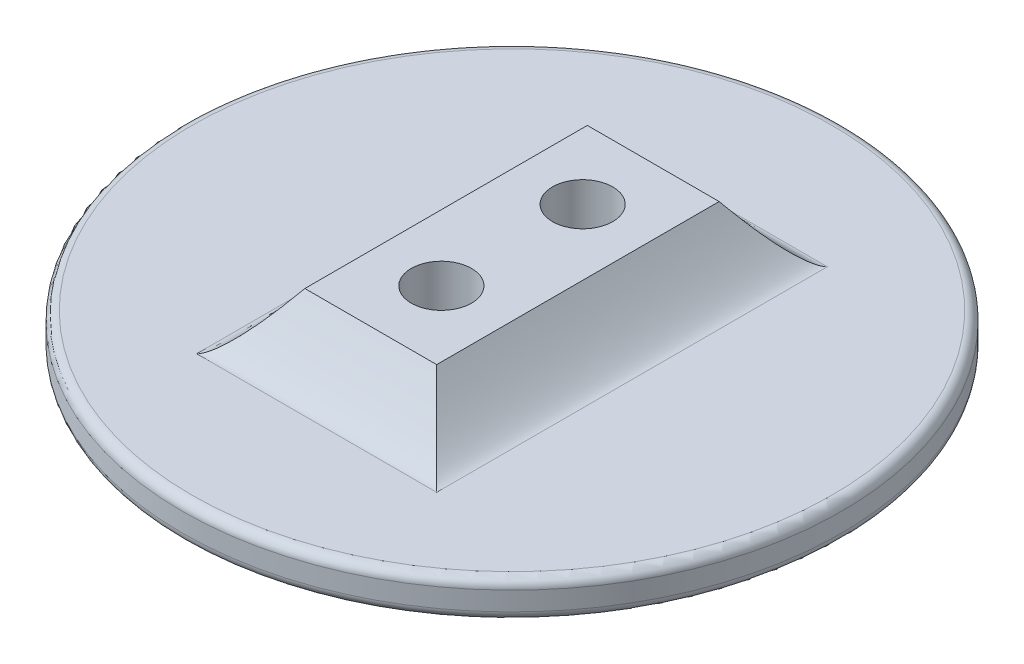
ISO-10303-21;
HEADER;
FILE_DESCRIPTION(('STEP AP214'),'2;1');
FILE_NAME('part.step','',(''),(''),'','','');
FILE_SCHEMA(('AUTOMOTIVE_DESIGN { 1 0 10303 214 1 1 1 1 }'));
ENDSEC;
DATA;
#1=APPLICATION_CONTEXT('core data for automotive mechanical design processes');
#2=APPLICATION_PROTOCOL_DEFINITION('international standard','automotive_design',2000,#1);
#3=PRODUCT_CONTEXT('',#1,'mechanical');
#4=PRODUCT('Part','Part','',(#3));
#5=PRODUCT_RELATED_PRODUCT_CATEGORY('part','',(#4));
#6=PRODUCT_DEFINITION_FORMATION('','',#4);
#7=PRODUCT_DEFINITION_CONTEXT('part definition',#1,'design');
#8=PRODUCT_DEFINITION('design','',#6,#7);
#9=PRODUCT_DEFINITION_SHAPE('','',#8);
#10=(LENGTH_UNIT() NAMED_UNIT(*) SI_UNIT(.MILLI.,.METRE.));
#11=(NAMED_UNIT(*) PLANE_ANGLE_UNIT() SI_UNIT($,.RADIAN.));
#12=(NAMED_UNIT(*) SI_UNIT($,.STERADIAN.) SOLID_ANGLE_UNIT());
#13=UNCERTAINTY_MEASURE_WITH_UNIT(LENGTH_MEASURE(1.E-05),#10,'distance_accuracy_value','');
#14=(GEOMETRIC_REPRESENTATION_CONTEXT(3) GLOBAL_UNCERTAINTY_ASSIGNED_CONTEXT((#13)) GLOBAL_UNIT_ASSIGNED_CONTEXT((#10,
#11,#12)) REPRESENTATION_CONTEXT('',''));
#15=CARTESIAN_POINT('',(0.,0.,0.));
#16=DIRECTION('',(0.,0.,1.));
#17=DIRECTION('',(1.,0.,0.));
#18=AXIS2_PLACEMENT_3D('',#15,#16,#17);
#19=CARTESIAN_POINT('',(0.,0.,0.));
#20=DIRECTION('',(0.,1.,0.));
#21=DIRECTION('',(0.,0.,1.));
#22=AXIS2_PLACEMENT_3D('',#19,#20,#21);
#23=PLANE('',#22);
#24=CARTESIAN_POINT('',(0.,0.,0.));
#25=DIRECTION('',(0.,1.,0.));
#26=DIRECTION('',(0.,0.,1.));
#27=AXIS2_PLACEMENT_3D('',#24,#25,#26);
#28=CIRCLE('',#27,34.);
#29=CARTESIAN_POINT('',(0.,0.,34.));
#30=VERTEX_POINT('',#29);
#31=EDGE_CURVE('E12',#30,#30,#28,.F.);
#32=ORIENTED_EDGE('',*,*,#31,.T.);
#33=EDGE_LOOP('',(#32));
#34=FACE_BOUND('',#33,.T.);
#35=CARTESIAN_POINT('',(0.,0.,7.5));
#36=DIRECTION('',(0.,-1.,0.));
#37=DIRECTION('',(0.,0.,-1.));
#38=AXIS2_PLACEMENT_3D('',#35,#36,#37);
#39=CIRCLE('',#38,3.2);
#40=CARTESIAN_POINT('',(0.,0.,4.3));
#41=VERTEX_POINT('',#40);
#42=EDGE_CURVE('E340',#41,#41,#39,.T.);
#43=ORIENTED_EDGE('',*,*,#42,.F.);
#44=EDGE_LOOP('',(#43));
#45=FACE_BOUND('',#44,.T.);
#46=CARTESIAN_POINT('',(0.,0.,-7.5));
#47=DIRECTION('',(0.,1.,0.));
#48=DIRECTION('',(0.,0.,1.));
#49=AXIS2_PLACEMENT_3D('',#46,#47,#48);
#50=CIRCLE('',#49,3.2);
#51=CARTESIAN_POINT('',(0.,0.,-4.29999999999999));
#52=VERTEX_POINT('',#51);
#53=EDGE_CURVE('E329',#52,#52,#50,.T.);
#54=ORIENTED_EDGE('',*,*,#53,.T.);
#55=EDGE_LOOP('',(#54));
#56=FACE_BOUND('',#55,.T.);
#57=ADVANCED_FACE('F45',(#34,#45,#56),#23,.F.);
#58=CARTESIAN_POINT('',(0.,10.,0.));
#59=DIRECTION('',(0.,-1.,0.));
#60=DIRECTION('',(0.,0.,-1.));
#61=AXIS2_PLACEMENT_3D('',#58,#59,#60);
#62=PLANE('',#61);
#63=CARTESIAN_POINT('',(7.,10.,-22.8190189111918));
#64=CARTESIAN_POINT('',(7.,10.,-22.1275334896406));
#65=CARTESIAN_POINT('',(7.,10.,-21.4360480680893));
#66=CARTESIAN_POINT('',(7.,10.,-6.91485421551268));
#67=CARTESIAN_POINT('',(7.,10.,6.91485421550068));
#68=CARTESIAN_POINT('',(7.,10.,21.4360480680899));
#69=CARTESIAN_POINT('',(7.,10.,22.1275334896401));
#70=CARTESIAN_POINT('',(7.,10.,22.8190189111918));
#71=(BOUNDED_CURVE() B_SPLINE_CURVE(3,(#63,#64,#65,#66,#67,#68,#69,#70),.UNSPECIFIED.,.F.,
.F.) B_SPLINE_CURVE_WITH_KNOTS((4,2,2,4),(-0.00781901891119183,-0.00574456264653803,
0.035744562646538,0.0378190189111918),
.UNSPECIFIED.) CURVE() GEOMETRIC_REPRESENTATION_ITEM() RATIONAL_B_SPLINE_CURVE((1.,1.,1.,1.,1.,
1.,1.,1.)) REPRESENTATION_ITEM(''));
#72=CARTESIAN_POINT('',(7.,10.,15.));
#73=VERTEX_POINT('',#72);
#74=CARTESIAN_POINT('',(7.,10.,-15.));
#75=VERTEX_POINT('',#74);
#76=EDGE_CURVE('E90',#73,#75,#71,.F.);
#77=ORIENTED_EDGE('',*,*,#76,.T.);
#78=CARTESIAN_POINT('',(-14.0817907788649,10.,-15.));
#79=CARTESIAN_POINT('',(-13.6360480680896,10.,-15.));
#80=CARTESIAN_POINT('',(-13.1903053573133,10.,-15.));
#81=CARTESIAN_POINT('',(-3.82970843103308,10.,-15.));
#82=CARTESIAN_POINT('',(5.08514578448732,10.,-15.));
#83=CARTESIAN_POINT('',(14.4457427107756,10.,-15.));
#84=CARTESIAN_POINT('',(14.8914854215513,10.,-15.));
#85=CARTESIAN_POINT('',(15.3372281323269,10.,-15.));
#86=(BOUNDED_CURVE() B_SPLINE_CURVE(3,(#78,#79,#80,#81,#82,#83,#84,#85),.UNSPECIFIED.,.F.,
.F.) B_SPLINE_CURVE_WITH_KNOTS((4,2,2,4),(-0.0223372281323269,-0.021,0.00574456264653803,
0.00708179077886493),
.UNSPECIFIED.) CURVE() GEOMETRIC_REPRESENTATION_ITEM() RATIONAL_B_SPLINE_CURVE((1.,1.,1.,1.,1.,
1.,1.,1.)) REPRESENTATION_ITEM(''));
#87=CARTESIAN_POINT('',(-7.,10.,-15.));
#88=VERTEX_POINT('',#87);
#89=EDGE_CURVE('E97',#75,#88,#86,.F.);
#90=ORIENTED_EDGE('',*,*,#89,.T.);
#91=CARTESIAN_POINT('',(-7.,10.,24.2));
#92=CARTESIAN_POINT('',(-7.,10.,23.4666666666662));
#93=CARTESIAN_POINT('',(-7.,10.,22.733333333334));
#94=CARTESIAN_POINT('',(-7.,10.,7.33333333332061));
#95=CARTESIAN_POINT('',(-7.,10.,-7.33333333333333));
#96=CARTESIAN_POINT('',(-7.,10.,-22.7333333333333));
#97=CARTESIAN_POINT('',(-7.,10.,-23.4666666666667));
#98=CARTESIAN_POINT('',(-7.,10.,-24.2));
#99=(BOUNDED_CURVE() B_SPLINE_CURVE(3,(#91,#92,#93,#94,#95,#96,#97,#98),.UNSPECIFIED.,.F.,
.F.) B_SPLINE_CURVE_WITH_KNOTS((4,2,2,4),(-0.0392,-0.037,0.007,0.0092),
.UNSPECIFIED.) CURVE() GEOMETRIC_REPRESENTATION_ITEM() RATIONAL_B_SPLINE_CURVE((1.,1.,1.,1.,1.,
1.,1.,1.)) REPRESENTATION_ITEM(''));
#100=CARTESIAN_POINT('',(-7.,10.,15.));
#101=VERTEX_POINT('',#100);
#102=EDGE_CURVE('E126',#88,#101,#99,.F.);
#103=ORIENTED_EDGE('',*,*,#102,.T.);
#104=CARTESIAN_POINT('',(15.3372281323269,10.,15.));
#105=CARTESIAN_POINT('',(14.8914854215513,10.,15.));
#106=CARTESIAN_POINT('',(14.4457427107756,10.,15.));
#107=CARTESIAN_POINT('',(5.08514578448732,10.,15.));
#108=CARTESIAN_POINT('',(-3.82970843103308,10.,15.));
#109=CARTESIAN_POINT('',(-13.1903053573133,10.,15.));
#110=CARTESIAN_POINT('',(-13.6360480680896,10.,15.));
#111=CARTESIAN_POINT('',(-14.0817907788649,10.,15.));
#112=(BOUNDED_CURVE() B_SPLINE_CURVE(3,(#104,#105,#106,#107,#108,#109,#110,#111),.UNSPECIFIED.,
.F.,.F.) B_SPLINE_CURVE_WITH_KNOTS((4,2,2,4),(-0.00708179077886493,-0.00574456264653803,0.021,
0.0223372281323269),
.UNSPECIFIED.) CURVE() GEOMETRIC_REPRESENTATION_ITEM() RATIONAL_B_SPLINE_CURVE((1.,1.,1.,1.,1.,
1.,1.,1.)) REPRESENTATION_ITEM(''));
#113=EDGE_CURVE('E100',#101,#73,#112,.F.);
#114=ORIENTED_EDGE('',*,*,#113,.T.);
#115=EDGE_LOOP('',(#77,#90,#103,#114));
#116=FACE_BOUND('',#115,.T.);
#117=CARTESIAN_POINT('',(0.,10.,7.5));
#118=DIRECTION('',(0.,-1.,0.));
#119=DIRECTION('',(0.,0.,-1.));
#120=AXIS2_PLACEMENT_3D('',#117,#118,#119);
#121=CIRCLE('',#120,3.2);
#122=CARTESIAN_POINT('',(0.,10.,4.3));
#123=VERTEX_POINT('',#122);
#124=EDGE_CURVE('E336',#123,#123,#121,.T.);
#125=ORIENTED_EDGE('',*,*,#124,.T.);
#126=EDGE_LOOP('',(#125));
#127=FACE_BOUND('',#126,.T.);
#128=CARTESIAN_POINT('',(0.,10.,-7.5));
#129=DIRECTION('',(0.,1.,0.));
#130=DIRECTION('',(0.,0.,1.));
#131=AXIS2_PLACEMENT_3D('',#128,#129,#130);
#132=CIRCLE('',#131,3.2);
#133=CARTESIAN_POINT('',(0.,10.,-4.29999999999999));
#134=VERTEX_POINT('',#133);
#135=EDGE_CURVE('E332',#134,#134,#132,.T.);
#136=ORIENTED_EDGE('',*,*,#135,.F.);
#137=EDGE_LOOP('',(#136));
#138=FACE_BOUND('',#137,.T.);
#139=ADVANCED_FACE('F93',(#116,#127,#138),#62,.F.);
#140=CARTESIAN_POINT('',(0.,4.,0.));
#141=DIRECTION('',(0.,-1.,0.));
#142=DIRECTION('',(0.,0.,-1.));
#143=AXIS2_PLACEMENT_3D('',#140,#141,#142);
#144=CYLINDRICAL_SURFACE('',#143,35.);
#145=CARTESIAN_POINT('',(0.,3.,0.));
#146=DIRECTION('',(0.,1.,0.));
#147=DIRECTION('',(0.,0.,1.));
#148=AXIS2_PLACEMENT_3D('',#145,#146,#147);
#149=CIRCLE('',#148,35.);
#150=CARTESIAN_POINT('',(0.,3.,35.));
#151=VERTEX_POINT('',#150);
#152=EDGE_CURVE('E54',#151,#151,#149,.F.);
#153=ORIENTED_EDGE('',*,*,#152,.T.);
#154=EDGE_LOOP('',(#153));
#155=FACE_BOUND('',#154,.T.);
#156=CARTESIAN_POINT('',(0.,1.,0.));
#157=DIRECTION('',(0.,1.,0.));
#158=DIRECTION('',(0.,0.,1.));
#159=AXIS2_PLACEMENT_3D('',#156,#157,#158);
#160=CIRCLE('',#159,35.);
#161=CARTESIAN_POINT('',(0.,1.,35.));
#162=VERTEX_POINT('',#161);
#163=EDGE_CURVE('E248',#162,#162,#160,.T.);
#164=ORIENTED_EDGE('',*,*,#163,.T.);
#165=EDGE_LOOP('',(#164));
#166=FACE_BOUND('',#165,.T.);
#167=ADVANCED_FACE('F215',(#155,#166),#144,.T.);
#168=CARTESIAN_POINT('',(0.,4.,0.));
#169=DIRECTION('',(0.,1.,0.));
#170=DIRECTION('',(0.,0.,1.));
#171=AXIS2_PLACEMENT_3D('',#168,#169,#170);
#172=PLANE('',#171);
#173=CARTESIAN_POINT('',(0.,4.,0.));
#174=DIRECTION('',(0.,1.,0.));
#175=DIRECTION('',(0.,0.,1.));
#176=AXIS2_PLACEMENT_3D('',#173,#174,#175);
#177=CIRCLE('',#176,34.);
#178=CARTESIAN_POINT('',(0.,4.,34.));
#179=VERTEX_POINT('',#178);
#180=EDGE_CURVE('E239',#179,#179,#177,.T.);
#181=ORIENTED_EDGE('',*,*,#180,.T.);
#182=EDGE_LOOP('',(#181));
#183=FACE_BOUND('',#182,.T.);
#184=CARTESIAN_POINT('',(-14.0817907788649,4.,20.744562646538));
#185=CARTESIAN_POINT('',(-13.6360480680896,4.,20.744562646538));
#186=CARTESIAN_POINT('',(-13.1903053573133,4.,20.744562646538));
#187=CARTESIAN_POINT('',(-3.82970843103308,4.,20.744562646538));
#188=CARTESIAN_POINT('',(5.08514578448733,4.,20.744562646538));
#189=CARTESIAN_POINT('',(14.4457427107756,4.,20.744562646538));
#190=CARTESIAN_POINT('',(14.8914854215513,4.,20.744562646538));
#191=CARTESIAN_POINT('',(15.3372281323269,4.,20.744562646538));
#192=(BOUNDED_CURVE() B_SPLINE_CURVE(3,(#184,#185,#186,#187,#188,#189,#190,#191),.UNSPECIFIED.,
.F.,.F.) B_SPLINE_CURVE_WITH_KNOTS((4,2,2,4),(-0.00708179077886493,-0.00574456264653803,0.021,
0.0223372281323269),
.UNSPECIFIED.) CURVE() GEOMETRIC_REPRESENTATION_ITEM() RATIONAL_B_SPLINE_CURVE((1.,1.,1.,1.,1.,
1.,1.,1.)) REPRESENTATION_ITEM(''));
#193=CARTESIAN_POINT('',(12.744562646538,4.,20.7445626465695));
#194=VERTEX_POINT('',#193);
#195=CARTESIAN_POINT('',(-12.7445626465181,4.,20.744562646538));
#196=VERTEX_POINT('',#195);
#197=EDGE_CURVE('E70',#194,#196,#192,.F.);
#198=ORIENTED_EDGE('',*,*,#197,.T.);
#199=CARTESIAN_POINT('',(-12.744562646538,4.,-24.2));
#200=CARTESIAN_POINT('',(-12.744562646538,4.,-23.4666666666667));
#201=CARTESIAN_POINT('',(-12.744562646538,4.,-22.7333333333333));
#202=CARTESIAN_POINT('',(-12.744562646538,4.,-7.33333333333333));
#203=CARTESIAN_POINT('',(-12.744562646538,4.,7.33333333332061));
#204=CARTESIAN_POINT('',(-12.744562646538,4.,22.733333333334));
#205=CARTESIAN_POINT('',(-12.744562646538,4.,23.4666666666662));
#206=CARTESIAN_POINT('',(-12.744562646538,4.,24.2));
#207=(BOUNDED_CURVE() B_SPLINE_CURVE(3,(#199,#200,#201,#202,#203,#204,#205,#206),.UNSPECIFIED.,
.F.,.F.) B_SPLINE_CURVE_WITH_KNOTS((4,2,2,4),(-0.0392,-0.037,0.007,0.0092),
.UNSPECIFIED.) CURVE() GEOMETRIC_REPRESENTATION_ITEM() RATIONAL_B_SPLINE_CURVE((0.999999999999999,
0.999999999999999,0.999999999999999,0.999999999999999,0.999999999999999,0.999999999999999,
0.999999999999999,0.999999999999999)) REPRESENTATION_ITEM(''));
#208=CARTESIAN_POINT('',(-12.7445626465181,4.,-20.744562646538));
#209=VERTEX_POINT('',#208);
#210=EDGE_CURVE('E249',#196,#209,#207,.F.);
#211=ORIENTED_EDGE('',*,*,#210,.T.);
#212=CARTESIAN_POINT('',(15.3372281323269,4.,-20.744562646538));
#213=CARTESIAN_POINT('',(14.8914854215513,4.,-20.744562646538));
#214=CARTESIAN_POINT('',(14.4457427107756,4.,-20.744562646538));
#215=CARTESIAN_POINT('',(5.08514578448733,4.,-20.744562646538));
#216=CARTESIAN_POINT('',(-3.82970843103308,4.,-20.744562646538));
#217=CARTESIAN_POINT('',(-13.1903053573133,4.,-20.744562646538));
#218=CARTESIAN_POINT('',(-13.6360480680896,4.,-20.744562646538));
#219=CARTESIAN_POINT('',(-14.0817907788649,4.,-20.744562646538));
#220=(BOUNDED_CURVE() B_SPLINE_CURVE(3,(#212,#213,#214,#215,#216,#217,#218,#219),.UNSPECIFIED.,
.F.,.F.) B_SPLINE_CURVE_WITH_KNOTS((4,2,2,4),(-0.0223372281323269,-0.021,0.00574456264653803,
0.00708179077886493),
.UNSPECIFIED.) CURVE() GEOMETRIC_REPRESENTATION_ITEM() RATIONAL_B_SPLINE_CURVE((0.999999999999999,
0.999999999999999,0.999999999999999,0.999999999999999,0.999999999999999,0.999999999999999,
0.999999999999999,0.999999999999999)) REPRESENTATION_ITEM(''));
#221=CARTESIAN_POINT('',(12.744562646538,4.,-20.7445626465382));
#222=VERTEX_POINT('',#221);
#223=EDGE_CURVE('E365',#209,#222,#220,.F.);
#224=ORIENTED_EDGE('',*,*,#223,.T.);
#225=CARTESIAN_POINT('',(12.744562646538,4.,22.8190189111918));
#226=CARTESIAN_POINT('',(12.744562646538,4.,22.1275334896401));
#227=CARTESIAN_POINT('',(12.744562646538,4.,21.4360480680899));
#228=CARTESIAN_POINT('',(12.744562646538,4.,6.91485421550068));
#229=CARTESIAN_POINT('',(12.744562646538,4.,-6.91485421551267));
#230=CARTESIAN_POINT('',(12.744562646538,4.,-21.4360480680893));
#231=CARTESIAN_POINT('',(12.744562646538,4.,-22.1275334896406));
#232=CARTESIAN_POINT('',(12.744562646538,4.,-22.8190189111918));
#233=(BOUNDED_CURVE() B_SPLINE_CURVE(3,(#225,#226,#227,#228,#229,#230,#231,#232),.UNSPECIFIED.,
.F.,.F.) B_SPLINE_CURVE_WITH_KNOTS((4,2,2,4),(-0.00781901891119183,-0.00574456264653803,
0.035744562646538,0.0378190189111918),
.UNSPECIFIED.) CURVE() GEOMETRIC_REPRESENTATION_ITEM() RATIONAL_B_SPLINE_CURVE((0.999999999999999,
0.999999999999999,0.999999999999999,0.999999999999999,0.999999999999999,0.999999999999999,
0.999999999999999,0.999999999999999)) REPRESENTATION_ITEM(''));
#234=EDGE_CURVE('E114',#222,#194,#233,.F.);
#235=ORIENTED_EDGE('',*,*,#234,.T.);
#236=EDGE_LOOP('',(#198,#211,#224,#235));
#237=FACE_BOUND('',#236,.T.);
#238=ADVANCED_FACE('F218',(#183,#237),#172,.T.);
#239=CARTESIAN_POINT('',(7.,10.,22.8190189111918));
#240=CARTESIAN_POINT('',(7.,10.,22.1275334896401));
#241=CARTESIAN_POINT('',(7.,10.,21.4360480680899));
#242=CARTESIAN_POINT('',(7.,10.,6.91485421550068));
#243=CARTESIAN_POINT('',(7.,10.,-6.91485421551268));
#244=CARTESIAN_POINT('',(7.,10.,-21.4360480680893));
#245=CARTESIAN_POINT('',(7.,10.,-22.1275334896406));
#246=CARTESIAN_POINT('',(7.,10.,-22.8190189111918));
#247=CARTESIAN_POINT('',(11.1778637429368,4.,22.8190189111918));
#248=CARTESIAN_POINT('',(11.1778637429368,4.,22.1275334896401));
#249=CARTESIAN_POINT('',(11.1778637429368,4.,21.4360480680899));
#250=CARTESIAN_POINT('',(11.1778637429368,4.,6.91485421550068));
#251=CARTESIAN_POINT('',(11.1778637429368,4.,-6.91485421551268));
#252=CARTESIAN_POINT('',(11.1778637429368,4.,-21.4360480680893));
#253=CARTESIAN_POINT('',(11.1778637429368,4.,-22.1275334896406));
#254=CARTESIAN_POINT('',(11.1778637429368,4.,-22.8190189111918));
#255=CARTESIAN_POINT('',(12.744562646538,4.,22.8190189111918));
#256=CARTESIAN_POINT('',(12.744562646538,4.,22.1275334896401));
#257=CARTESIAN_POINT('',(12.744562646538,4.,21.4360480680899));
#258=CARTESIAN_POINT('',(12.744562646538,4.,6.91485421550068));
#259=CARTESIAN_POINT('',(12.744562646538,4.,-6.91485421551268));
#260=CARTESIAN_POINT('',(12.744562646538,4.,-21.4360480680893));
#261=CARTESIAN_POINT('',(12.744562646538,4.,-22.1275334896406));
#262=CARTESIAN_POINT('',(12.744562646538,4.,-22.8190189111918));
#263=(BOUNDED_SURFACE() B_SPLINE_SURFACE(2,3,((#239,#240,#241,#242,#243,#244,#245,#246),(#247,
#248,#249,#250,#251,#252,#253,#254),(#255,#256,#257,#258,#259,#260,#261,#262)),.UNSPECIFIED.,
.F.,.F.,.F.) B_SPLINE_SURFACE_WITH_KNOTS((3,3),(4,2,2,4),(0.,1.),(-0.00781901891119183,
-0.00574456264653803,0.035744562646538,0.0378190189111918),
.UNSPECIFIED.) GEOMETRIC_REPRESENTATION_ITEM() RATIONAL_B_SPLINE_SURFACE(((1.,1.,1.,1.,1.,1.,1.,
1.),(0.886405260427918,0.886405260427918,0.886405260427918,0.886405260427918,0.886405260427918,
0.886405260427918,0.886405260427918,0.886405260427918),(1.,1.,1.,1.,1.,1.,1.,1.))) REPRESENTATION_ITEM('') SURFACE());
#264=CARTESIAN_POINT('',(12.7445626465394,4.,20.744562646538));
#265=CARTESIAN_POINT('',(12.7332712110493,4.00000088450244,20.7332713393002));
#266=CARTESIAN_POINT('',(12.7219774747539,4.00029748881485,20.721984906245));
#267=CARTESIAN_POINT('',(12.6990102338419,4.00145539801318,20.6990438716048));
#268=CARTESIAN_POINT('',(12.6873370072281,4.00233574669782,20.6873899377827));
#269=CARTESIAN_POINT('',(12.6636109924475,4.00466797712838,20.6637117223748));
#270=CARTESIAN_POINT('',(12.6515589901403,4.0061385129345,20.6516885213144));
#271=CARTESIAN_POINT('',(12.6270750579688,4.00965946342789,20.62726936534));
#272=CARTESIAN_POINT('',(12.614644353153,4.0117281205431,20.6148748485449));
#273=CARTESIAN_POINT('',(12.5761304207918,4.01893586316441,20.576479077374));
#274=CARTESIAN_POINT('',(12.5501241963712,4.02494353613902,20.5505612697367));
#275=CARTESIAN_POINT('',(12.496582668471,4.03929978084561,20.4972023577608));
#276=CARTESIAN_POINT('',(12.4690656458697,4.04778125128356,20.4697795124189));
#277=CARTESIAN_POINT('',(12.4124953525612,4.06714911682986,20.4133917875257));
#278=CARTESIAN_POINT('',(12.3834638942033,4.07815927844022,20.3844478995234));
#279=CARTESIAN_POINT('',(12.323862217561,4.10264450269284,20.3250060932487));
#280=CARTESIAN_POINT('',(12.2933164473432,4.11623408699187,20.2945312390745));
#281=CARTESIAN_POINT('',(12.2306836758159,4.14593511314571,20.2320179092601));
#282=CARTESIAN_POINT('',(12.1986227476901,4.16215215697452,20.200003788718));
#283=CARTESIAN_POINT('',(12.1329584448074,4.19716114944204,20.1344060493865));
#284=CARTESIAN_POINT('',(12.0993820397023,4.2160502536587,20.1008475518013));
#285=CARTESIAN_POINT('',(12.0306857973057,4.25645162108196,20.0321580438698));
#286=CARTESIAN_POINT('',(11.9955931998851,4.27805312134233,19.997052477094));
#287=CARTESIAN_POINT('',(11.9238656910939,4.32392496891205,19.9252705812846));
#288=CARTESIAN_POINT('',(11.8872579139584,4.34827733942096,19.8886197958355));
#289=CARTESIAN_POINT('',(11.7720746537704,4.42747609658127,19.7732660511689));
#290=CARTESIAN_POINT('',(11.6943547796516,4.48475820036347,19.6953786907456));
#291=CARTESIAN_POINT('',(11.5326600193203,4.61010963930619,19.5333122151831));
#292=CARTESIAN_POINT('',(11.4488827353102,4.67868040203541,19.449328691206));
#293=CARTESIAN_POINT('',(11.2750758405784,4.82682158090892,19.275197950955));
#294=CARTESIAN_POINT('',(11.1852221097895,4.90681512364147,19.1852370763981));
#295=CARTESIAN_POINT('',(10.9894235506991,5.08703667796774,18.989405593496));
#296=CARTESIAN_POINT('',(10.8838510379438,5.1881139824289,18.8839478183384));
#297=CARTESIAN_POINT('',(10.6624302210118,5.40699799659951,18.6627031826071));
#298=CARTESIAN_POINT('',(10.5468618259593,5.52536032976483,18.5471882226171));
#299=CARTESIAN_POINT('',(10.3054355022852,5.77974255970204,18.3057661703185));
#300=CARTESIAN_POINT('',(10.1798512342954,5.91626864264818,18.1801207525126));
#301=CARTESIAN_POINT('',(9.91841883832075,6.20769624562494,17.918519804112));
#302=CARTESIAN_POINT('',(9.78282740238868,6.36305347528136,17.7828168905402));
#303=CARTESIAN_POINT('',(9.54847627185461,6.63743245998003,17.548484083104));
#304=CARTESIAN_POINT('',(9.44920354233404,6.75553515723914,17.4492865253215));
#305=CARTESIAN_POINT('',(9.24146038503635,7.00639663827698,17.2416686299004));
#306=CARTESIAN_POINT('',(9.13312916820702,7.13938307026698,17.1333840043002));
#307=CARTESIAN_POINT('',(8.90725385810644,7.42079840041071,16.9075240756041));
#308=CARTESIAN_POINT('',(8.78985621450242,7.56945557419433,16.7900870862512));
#309=CARTESIAN_POINT('',(8.54589690331707,7.88286712629399,16.5459634929886));
#310=CARTESIAN_POINT('',(8.4194834767101,8.04784631348297,16.4194176034006));
#311=CARTESIAN_POINT('',(8.21511561926382,8.31783428074327,16.2151568017267));
#312=CARTESIAN_POINT('',(8.13675776353491,8.42214303177751,16.1369176474056));
#313=CARTESIAN_POINT('',(7.96022242096993,8.65909987875703,15.9606156514729));
#314=CARTESIAN_POINT('',(7.86222887132654,8.79201533516798,15.8627275427967));
#315=CARTESIAN_POINT('',(7.64639781277585,9.08781674448681,15.6469405711774));
#316=CARTESIAN_POINT('',(7.52880317311976,9.25102723861905,15.5292440376686));
#317=CARTESIAN_POINT('',(7.27374210553929,9.60890371474876,15.2739217420632));
#318=CARTESIAN_POINT('',(7.13652629394845,9.8039224173187,15.1365395423831));
#319=CARTESIAN_POINT('',(7.,10.,15.));
#320=B_SPLINE_CURVE_WITH_KNOTS('',3,(#264,#265,#266,#267,#268,#269,#270,#271,#272,#273,#274,
#275,#276,#277,#278,#279,#280,#281,#282,#283,#284,#285,#286,#287,#288,#289,#290,#291,#292,#293,
#294,#295,#296,#297,#298,#299,#300,#301,#302,#303,#304,#305,#306,#307,#308,#309,#310,#311,#312,
#313,#314,#315,#316,#317,#318,#319),.UNSPECIFIED.,.F.,.F.,(4,2,2,2,2,2,2,2,2,2,2,2,2,2,2,2,2,2,
2,2,2,2,2,2,2,2,2,4),(0.,0.0478998635212183,0.097444762122604,0.148697408306776,
0.201716868749929,0.313264610068907,0.432507612619369,0.55980688283463,0.695482596013402,
0.839818391163016,0.99306485563878,1.15544229507422,1.32714290068431,1.69912404469222,
2.11007127236863,2.56063652237244,3.10123271975606,3.70643971569534,4.37850363166282,
5.1189877417917,5.66923407115527,6.27774787637148,6.94634355684667,7.67632496749558,
8.13269238897504,8.70858259078536,9.40775925044743,10.2333293545689),.UNSPECIFIED.);
#321=EDGE_CURVE('E119',#194,#73,#320,.T.);
#322=CARTESIAN_POINT('',(7.,10.,-15.));
#323=CARTESIAN_POINT('',(7.13652629394845,9.8039224173187,-15.1365395423831));
#324=CARTESIAN_POINT('',(7.27374210553929,9.60890371474876,-15.2739217420632));
#325=CARTESIAN_POINT('',(7.52880317311975,9.25102723861906,-15.5292440376686));
#326=CARTESIAN_POINT('',(7.64639781277584,9.08781674448684,-15.6469405711773));
#327=CARTESIAN_POINT('',(7.86222887132649,8.79201533516805,-15.8627275427967));
#328=CARTESIAN_POINT('',(7.96022242096986,8.65909987875713,-15.9606156514728));
#329=CARTESIAN_POINT('',(8.13675776353478,8.4221430317777,-16.1369176474055));
#330=CARTESIAN_POINT('',(8.21511561926365,8.3178342807435,-16.2151568017266));
#331=CARTESIAN_POINT('',(8.41948347670987,8.04784631348329,-16.4194176034004));
#332=CARTESIAN_POINT('',(8.5458969033168,7.88286712629435,-16.5459634929883));
#333=CARTESIAN_POINT('',(8.7898562145021,7.56945557419474,-16.7900870862509));
#334=CARTESIAN_POINT('',(8.9072538581061,7.42079840041115,-16.9075240756038));
#335=CARTESIAN_POINT('',(9.13312916820663,7.13938307026745,-17.1333840042999));
#336=CARTESIAN_POINT('',(9.24146038503595,7.00639663827747,-17.2416686299));
#337=CARTESIAN_POINT('',(9.44920354233362,6.75553515723964,-17.4492865253211));
#338=CARTESIAN_POINT('',(9.54847627185418,6.63743245998054,-17.5484840831035));
#339=CARTESIAN_POINT('',(9.78282740238822,6.36305347528189,-17.7828168905398));
#340=CARTESIAN_POINT('',(9.91841883832029,6.2076962456255,-17.9185198041115));
#341=CARTESIAN_POINT('',(10.1798512342948,5.91626864264877,-18.180120752512));
#342=CARTESIAN_POINT('',(10.3054355022846,5.77974255970262,-18.305766170318));
#343=CARTESIAN_POINT('',(10.5468618259587,5.5253603297655,-18.5471882226164));
#344=CARTESIAN_POINT('',(10.6624302210114,5.40699799660027,-18.6627031826063));
#345=CARTESIAN_POINT('',(10.8838510379429,5.18811398242946,-18.8839478183379));
#346=CARTESIAN_POINT('',(10.9894235506977,5.08703667796805,-18.9894055934957));
#347=CARTESIAN_POINT('',(11.185222109835,4.90681512360041,-19.1852370764427));
#348=CARTESIAN_POINT('',(11.2750758406719,4.82682158082855,-19.2751979510454));
#349=CARTESIAN_POINT('',(11.4488827354873,4.67868040189902,-19.44932869137));
#350=CARTESIAN_POINT('',(11.532660019532,4.61010963915176,-19.5333122153747));
#351=CARTESIAN_POINT('',(11.6943547799196,4.48475820019028,-19.6953786909769));
#352=CARTESIAN_POINT('',(11.7720746540593,4.42747609640605,-19.773266051412));
#353=CARTESIAN_POINT('',(11.8872579142738,4.3482773392489,-19.8886197960917));
#354=CARTESIAN_POINT('',(11.9238656914145,4.32392496874347,-19.9252705815416));
#355=CARTESIAN_POINT('',(11.9955932002127,4.27805312118299,-19.9970524773498));
#356=CARTESIAN_POINT('',(12.030685797635,4.25645162092823,-20.0321580441235));
#357=CARTESIAN_POINT('',(12.0993820400317,4.21605025351783,-20.1008475520481));
#358=CARTESIAN_POINT('',(12.1329584451351,4.19716114930827,-20.1344060496285));
#359=CARTESIAN_POINT('',(12.1986227480108,4.162152156856,-20.2000037889482));
#360=CARTESIAN_POINT('',(12.2306836761315,4.1459351130352,-20.2320179094832));
#361=CARTESIAN_POINT('',(12.293316447645,4.11623408689778,-20.2945312392815));
#362=CARTESIAN_POINT('',(12.3238622178541,4.10264450260705,-20.3250060934466));
#363=CARTESIAN_POINT('',(12.3834638944756,4.07815927837084,-20.3844478997015));
#364=CARTESIAN_POINT('',(12.4124953528214,4.06714911676849,-20.4133917876931));
#365=CARTESIAN_POINT('',(12.4690656461022,4.04778125123746,-20.4697795125637));
#366=CARTESIAN_POINT('',(12.496582668688,4.03929978080666,-20.4972023578935));
#367=CARTESIAN_POINT('',(12.5501241965536,4.02494353611307,-20.5505612698445));
#368=CARTESIAN_POINT('',(12.5761304209552,4.01893586314421,-20.5764790774687));
#369=CARTESIAN_POINT('',(12.6146443532858,4.01172812053007,-20.6148748486205));
#370=CARTESIAN_POINT('',(12.6270750580906,4.00965946341703,-20.6272693654088));
#371=CARTESIAN_POINT('',(12.6515589902397,4.00613851292745,-20.6516885213696));
#372=CARTESIAN_POINT('',(12.6636109925351,4.00466797712296,-20.6637117224232));
#373=CARTESIAN_POINT('',(12.6873370072915,4.00233574669506,-20.6873899378173));
#374=CARTESIAN_POINT('',(12.6990102338927,4.00145539801144,-20.6990438716324));
#375=CARTESIAN_POINT('',(12.7219774747787,4.0002974888145,-20.7219849062587));
#376=CARTESIAN_POINT('',(12.7332712110608,4.00000088450244,-20.7332713393069));
#377=CARTESIAN_POINT('',(12.7445626465371,4.,-20.744562646538));
#378=B_SPLINE_CURVE_WITH_KNOTS('',3,(#322,#323,#324,#325,#326,#327,#328,#329,#330,#331,#332,
#333,#334,#335,#336,#337,#338,#339,#340,#341,#342,#343,#344,#345,#346,#347,#348,#349,#350,#351,
#352,#353,#354,#355,#356,#357,#358,#359,#360,#361,#362,#363,#364,#365,#366,#367,#368,#369,#370,
#371,#372,#373,#374,#375,#376,#377),.UNSPECIFIED.,.F.,.F.,(4,2,2,2,2,2,2,2,2,2,2,2,2,2,2,2,2,2,
2,2,2,2,2,2,2,2,2,4),(0.,0.825570104121487,1.52474676378349,2.10063696559367,2.55700438707292,
3.28698579772166,3.95558147819673,4.56409528341286,5.11434161277641,5.85482572290516,
6.52688963887252,7.1320966348117,7.67269283219526,8.12325808243004,8.53420531024767,
8.90618645431977,9.07788705993702,9.24026449936497,9.39351096382005,9.53784675893708,
9.67352247207255,9.80082174223486,9.92006474472361,10.0316124859728,10.0846319463782,
10.1358845925227,10.1854294910826,10.2333293545605),.UNSPECIFIED.);
#379=EDGE_CURVE('E107',#75,#222,#378,.T.);
#380=ORIENTED_EDGE('',*,*,#321,.F.);
#381=ORIENTED_EDGE('',*,*,#234,.F.);
#382=ORIENTED_EDGE('',*,*,#379,.F.);
#383=ORIENTED_EDGE('',*,*,#76,.F.);
#384=EDGE_LOOP('',(#380,#381,#382,#383));
#385=FACE_BOUND('',#384,.T.);
#386=ADVANCED_FACE('F113',(#385),#263,.T.);
#387=CARTESIAN_POINT('',(15.3372281323269,10.,-15.));
#388=CARTESIAN_POINT('',(14.8914854215513,10.,-15.));
#389=CARTESIAN_POINT('',(14.4457427107756,10.,-15.));
#390=CARTESIAN_POINT('',(5.08514578448732,10.,-15.));
#391=CARTESIAN_POINT('',(-3.82970843103308,10.,-15.));
#392=CARTESIAN_POINT('',(-13.1903053573133,10.,-15.));
#393=CARTESIAN_POINT('',(-13.6360480680896,10.,-15.));
#394=CARTESIAN_POINT('',(-14.0817907788649,10.,-15.));
#395=CARTESIAN_POINT('',(15.3372281323269,4.,-19.1778637429368));
#396=CARTESIAN_POINT('',(14.8914854215513,4.,-19.1778637429368));
#397=CARTESIAN_POINT('',(14.4457427107756,4.,-19.1778637429368));
#398=CARTESIAN_POINT('',(5.08514578448732,4.,-19.1778637429368));
#399=CARTESIAN_POINT('',(-3.82970843103308,4.,-19.1778637429368));
#400=CARTESIAN_POINT('',(-13.1903053573133,4.,-19.1778637429368));
#401=CARTESIAN_POINT('',(-13.6360480680896,4.,-19.1778637429368));
#402=CARTESIAN_POINT('',(-14.0817907788649,4.,-19.1778637429368));
#403=CARTESIAN_POINT('',(15.3372281323269,4.,-20.744562646538));
#404=CARTESIAN_POINT('',(14.8914854215513,4.,-20.744562646538));
#405=CARTESIAN_POINT('',(14.4457427107756,4.,-20.744562646538));
#406=CARTESIAN_POINT('',(5.08514578448732,4.,-20.744562646538));
#407=CARTESIAN_POINT('',(-3.82970843103308,4.,-20.744562646538));
#408=CARTESIAN_POINT('',(-13.1903053573133,4.,-20.744562646538));
#409=CARTESIAN_POINT('',(-13.6360480680896,4.,-20.744562646538));
#410=CARTESIAN_POINT('',(-14.0817907788649,4.,-20.744562646538));
#411=(BOUNDED_SURFACE() B_SPLINE_SURFACE(2,3,((#387,#388,#389,#390,#391,#392,#393,#394),(#395,
#396,#397,#398,#399,#400,#401,#402),(#403,#404,#405,#406,#407,#408,#409,#410)),.UNSPECIFIED.,
.F.,.F.,.F.) B_SPLINE_SURFACE_WITH_KNOTS((3,3),(4,2,2,4),(0.,1.),(-0.0223372281323269,-0.021,
0.00574456264653803,0.00708179077886493),
.UNSPECIFIED.) GEOMETRIC_REPRESENTATION_ITEM() RATIONAL_B_SPLINE_SURFACE(((1.,1.,1.,1.,1.,1.,1.,
1.),(0.886405260427918,0.886405260427918,0.886405260427918,0.886405260427918,0.886405260427918,
0.886405260427918,0.886405260427918,0.886405260427918),(1.,1.,1.,1.,1.,1.,1.,1.))) REPRESENTATION_ITEM('') SURFACE());
#412=CARTESIAN_POINT('',(-7.,9.99999999999999,-15.));
#413=CARTESIAN_POINT('',(-7.13653954238306,9.80392241731882,-15.1365262939484));
#414=CARTESIAN_POINT('',(-7.27392174206303,9.608903714749,-15.2737421055391));
#415=CARTESIAN_POINT('',(-7.5292440376683,9.25102723861946,-15.5288031731195));
#416=CARTESIAN_POINT('',(-7.64694057117704,9.08781674448727,-15.6463978127755));
#417=CARTESIAN_POINT('',(-7.86272754279634,8.79201533516849,-15.8622288713262));
#418=CARTESIAN_POINT('',(-7.96061565147254,8.65909987875753,-15.9602224209696));
#419=CARTESIAN_POINT('',(-8.13691764740533,8.42214303177794,-16.1367577635346));
#420=CARTESIAN_POINT('',(-8.21515680172647,8.31783428074364,-16.2151156192635));
#421=CARTESIAN_POINT('',(-8.41941760340036,8.04784631348335,-16.4194834767098));
#422=CARTESIAN_POINT('',(-8.54596349298829,7.88286712629442,-16.5458969033167));
#423=CARTESIAN_POINT('',(-8.79008708625085,7.56945557419483,-16.789856214502));
#424=CARTESIAN_POINT('',(-8.90752407560373,7.42079840041125,-16.907253858106));
#425=CARTESIAN_POINT('',(-9.13338400429977,7.13938307026756,-17.1331291682065));
#426=CARTESIAN_POINT('',(-9.24166862989988,7.00639663827757,-17.2414603850359));
#427=CARTESIAN_POINT('',(-9.44928652532105,6.75553515723974,-17.4492035423335));
#428=CARTESIAN_POINT('',(-9.54848408310345,6.63743245998062,-17.5484762718541));
#429=CARTESIAN_POINT('',(-9.7828168905397,6.36305347528198,-17.7828274023882));
#430=CARTESIAN_POINT('',(-9.91851980411141,6.20769624562559,-17.9184188383202));
#431=CARTESIAN_POINT('',(-10.180120752512,5.91626864264886,-18.1798512342947));
#432=CARTESIAN_POINT('',(-10.3057661703179,5.77974255970271,-18.3054355022845));
#433=CARTESIAN_POINT('',(-10.5471882226163,5.5253603297656,-18.5468618259586));
#434=CARTESIAN_POINT('',(-10.6627031826062,5.40699799660038,-18.6624302210113));
#435=CARTESIAN_POINT('',(-10.8839478183378,5.18811398242955,-18.8838510379428));
#436=CARTESIAN_POINT('',(-10.9894055934957,5.08703667796811,-18.9894235506975));
#437=CARTESIAN_POINT('',(-11.1852370764471,4.90681512359636,-19.1852221098395));
#438=CARTESIAN_POINT('',(-11.2751979510543,4.82682158082059,-19.2750758406811));
#439=CARTESIAN_POINT('',(-11.4493286913863,4.67868040188549,-19.4488827355048));
#440=CARTESIAN_POINT('',(-11.5333122153937,4.61010963913644,-19.532660019553));
#441=CARTESIAN_POINT('',(-11.6953786909999,4.48475820017308,-19.6943547799462));
#442=CARTESIAN_POINT('',(-11.7732660514362,4.42747609638865,-19.7720746540879));
#443=CARTESIAN_POINT('',(-11.8886197961171,4.34827733923181,-19.8872579143052));
#444=CARTESIAN_POINT('',(-11.9252705815671,4.32392496872673,-19.9238656914464));
#445=CARTESIAN_POINT('',(-11.9970524773752,4.27805312116717,-19.9955932002452));
#446=CARTESIAN_POINT('',(-12.0321580441487,4.25645162091296,-20.0306857976677));
#447=CARTESIAN_POINT('',(-12.1008475520726,4.21605025350383,-20.0993820400644));
#448=CARTESIAN_POINT('',(-12.1344060496526,4.19716114929498,-20.1329584451676));
#449=CARTESIAN_POINT('',(-12.2000037889711,4.16215215684423,-20.1986227480427));
#450=CARTESIAN_POINT('',(-12.2320179095054,4.14593511302421,-20.2306836761628));
#451=CARTESIAN_POINT('',(-12.294531239302,4.11623408688843,-20.2933164476749));
#452=CARTESIAN_POINT('',(-12.3250060934663,4.10264450259852,-20.3238622178832));
#453=CARTESIAN_POINT('',(-12.3844478997192,4.07815927836395,-20.3834638945026));
#454=CARTESIAN_POINT('',(-12.4133917877097,4.06714911676239,-20.4124953528472));
#455=CARTESIAN_POINT('',(-12.4697795125781,4.04778125123288,-20.4690656461253));
#456=CARTESIAN_POINT('',(-12.4972023579067,4.03929978080279,-20.4965826687095));
#457=CARTESIAN_POINT('',(-12.5505612698552,4.02494353611049,-20.5501241965716));
#458=CARTESIAN_POINT('',(-12.5764790774781,4.01893586314219,-20.5761304209713));
#459=CARTESIAN_POINT('',(-12.614874848628,4.01172812052877,-20.6146443532989));
#460=CARTESIAN_POINT('',(-12.6272693654156,4.00965946341595,-20.6270750581027));
#461=CARTESIAN_POINT('',(-12.6516885213751,4.00613851292675,-20.6515589902494));
#462=CARTESIAN_POINT('',(-12.663711722428,4.00466797712242,-20.6636109925437));
#463=CARTESIAN_POINT('',(-12.6873899378207,4.00233574669478,-20.6873370072977));
#464=CARTESIAN_POINT('',(-12.6990438716351,4.00145539801126,-20.6990102338977));
#465=CARTESIAN_POINT('',(-12.72198490626,4.00029748881446,-20.7219774747811));
#466=CARTESIAN_POINT('',(-12.7332713393075,4.00000088450245,-20.7332712110618));
#467=CARTESIAN_POINT('',(-12.744562646538,4.,-20.7445626465368));
#468=B_SPLINE_CURVE_WITH_KNOTS('',3,(#412,#413,#414,#415,#416,#417,#418,#419,#420,#421,#422,
#423,#424,#425,#426,#427,#428,#429,#430,#431,#432,#433,#434,#435,#436,#437,#438,#439,#440,#441,
#442,#443,#444,#445,#446,#447,#448,#449,#450,#451,#452,#453,#454,#455,#456,#457,#458,#459,#460,
#461,#462,#463,#464,#465,#466,#467),.UNSPECIFIED.,.F.,.F.,(4,2,2,2,2,2,2,2,2,2,2,2,2,2,2,2,2,2,
2,2,2,2,2,2,2,2,2,4),(0.,0.82557010412098,1.52474676378281,2.10063696559315,2.55700438707287,
3.28698579772154,3.95558147819657,4.5640952834127,5.11434161277628,5.85482572290501,
6.52688963887235,7.13209663481153,7.67269283219509,8.12325808245284,8.5342053102845,
8.90618645436298,9.07788705998095,9.24026449940816,9.39351096386117,9.53784675897495,
9.67352247210613,9.80082174226318,9.92006474474578,10.031612485988,10.0846319463896,
10.1358845925302,10.185429491086,10.2333293545596),.UNSPECIFIED.);
#469=EDGE_CURVE('E61',#88,#209,#468,.T.);
#470=ORIENTED_EDGE('',*,*,#379,.T.);
#471=ORIENTED_EDGE('',*,*,#223,.F.);
#472=ORIENTED_EDGE('',*,*,#469,.F.);
#473=ORIENTED_EDGE('',*,*,#89,.F.);
#474=EDGE_LOOP('',(#470,#471,#472,#473));
#475=FACE_BOUND('',#474,.T.);
#476=ADVANCED_FACE('F123',(#475),#411,.T.);
#477=CARTESIAN_POINT('',(-14.0817907788649,10.,15.));
#478=CARTESIAN_POINT('',(-13.6360480680896,10.,15.));
#479=CARTESIAN_POINT('',(-13.1903053573133,10.,15.));
#480=CARTESIAN_POINT('',(-3.82970843103308,10.,15.));
#481=CARTESIAN_POINT('',(5.08514578448732,10.,15.));
#482=CARTESIAN_POINT('',(14.4457427107756,10.,15.));
#483=CARTESIAN_POINT('',(14.8914854215513,10.,15.));
#484=CARTESIAN_POINT('',(15.3372281323269,10.,15.));
#485=CARTESIAN_POINT('',(-14.0817907788649,4.,19.1778637429368));
#486=CARTESIAN_POINT('',(-13.6360480680896,4.,19.1778637429368));
#487=CARTESIAN_POINT('',(-13.1903053573133,4.,19.1778637429368));
#488=CARTESIAN_POINT('',(-3.82970843103308,4.,19.1778637429368));
#489=CARTESIAN_POINT('',(5.08514578448732,4.,19.1778637429368));
#490=CARTESIAN_POINT('',(14.4457427107756,4.,19.1778637429368));
#491=CARTESIAN_POINT('',(14.8914854215513,4.,19.1778637429368));
#492=CARTESIAN_POINT('',(15.3372281323269,4.,19.1778637429368));
#493=CARTESIAN_POINT('',(-14.0817907788649,4.,20.744562646538));
#494=CARTESIAN_POINT('',(-13.6360480680896,4.,20.744562646538));
#495=CARTESIAN_POINT('',(-13.1903053573133,4.,20.744562646538));
#496=CARTESIAN_POINT('',(-3.82970843103308,4.,20.744562646538));
#497=CARTESIAN_POINT('',(5.08514578448732,4.,20.744562646538));
#498=CARTESIAN_POINT('',(14.4457427107756,4.,20.744562646538));
#499=CARTESIAN_POINT('',(14.8914854215513,4.,20.744562646538));
#500=CARTESIAN_POINT('',(15.3372281323269,4.,20.744562646538));
#501=(BOUNDED_SURFACE() B_SPLINE_SURFACE(2,3,((#477,#478,#479,#480,#481,#482,#483,#484),(#485,
#486,#487,#488,#489,#490,#491,#492),(#493,#494,#495,#496,#497,#498,#499,#500)),.UNSPECIFIED.,
.F.,.F.,.F.) B_SPLINE_SURFACE_WITH_KNOTS((3,3),(4,2,2,4),(0.,1.),(-0.00708179077886493,
-0.00574456264653803,0.021,0.0223372281323269),
.UNSPECIFIED.) GEOMETRIC_REPRESENTATION_ITEM() RATIONAL_B_SPLINE_SURFACE(((1.,1.,1.,1.,1.,1.,1.,
1.),(0.886405260427918,0.886405260427918,0.886405260427918,0.886405260427918,0.886405260427918,
0.886405260427918,0.886405260427918,0.886405260427918),(1.,1.,1.,1.,1.,1.,1.,1.))) REPRESENTATION_ITEM('') SURFACE());
#502=CARTESIAN_POINT('',(-12.744562646538,4.,20.744562646538));
#503=CARTESIAN_POINT('',(-12.7332713393038,4.00000088450244,20.7332712110553));
#504=CARTESIAN_POINT('',(-12.7219849062523,4.00029748881466,20.7219774747671));
#505=CARTESIAN_POINT('',(-12.6990438716196,4.00145539801224,20.6990102338691));
#506=CARTESIAN_POINT('',(-12.6873899378013,4.00233574669633,20.6873370072621));
#507=CARTESIAN_POINT('',(-12.6637117224009,4.00466797712546,20.6636109924945));
#508=CARTESIAN_POINT('',(-12.6516885213441,4.0061385129307,20.6515589901937));
#509=CARTESIAN_POINT('',(-12.627269365377,4.00965946342205,20.6270750580342));
#510=CARTESIAN_POINT('',(-12.6148748485856,4.01172812053608,20.6146443532244));
#511=CARTESIAN_POINT('',(-12.5764790774249,4.01893586315353,20.5761304208796));
#512=CARTESIAN_POINT('',(-12.5505612697947,4.02494353612505,20.5501241964693));
#513=CARTESIAN_POINT('',(-12.4972023578322,4.03929978082464,20.4965826685877));
#514=CARTESIAN_POINT('',(-12.4697795124969,4.04778125125874,20.4690656459948));
#515=CARTESIAN_POINT('',(-12.4133917876158,4.06714911679682,20.4124953527012));
#516=CARTESIAN_POINT('',(-12.3844478996193,4.07815927840287,20.3834638943498));
#517=CARTESIAN_POINT('',(-12.3250060933553,4.10264450264666,20.3238622177188));
#518=CARTESIAN_POINT('',(-12.2945312391859,4.11623408694122,20.2933164475056));
#519=CARTESIAN_POINT('',(-12.2320179093802,4.14593511308622,20.2306836759857));
#520=CARTESIAN_POINT('',(-12.2000037888419,4.16215215691073,20.1986227478627));
#521=CARTESIAN_POINT('',(-12.1344060495168,4.19716114937004,20.1329584449837));
#522=CARTESIAN_POINT('',(-12.1008475519341,4.21605025358288,20.0993820398795));
#523=CARTESIAN_POINT('',(-12.0321580440063,4.25645162099921,20.0306857974829));
#524=CARTESIAN_POINT('',(-11.9970524772317,4.27805312125657,19.9955932000614));
#525=CARTESIAN_POINT('',(-11.9252705814229,4.32392496882131,19.9238656912665));
#526=CARTESIAN_POINT('',(-11.8886197959734,4.34827733932835,19.8872579141282));
#527=CARTESIAN_POINT('',(-11.7732660512998,4.42747609648696,19.7720746539259));
#528=CARTESIAN_POINT('',(-11.6953786908701,4.48475820027026,19.6943547797958));
#529=CARTESIAN_POINT('',(-11.5333122152862,4.61010963922309,19.5326600194342));
#530=CARTESIAN_POINT('',(-11.4493286912943,4.67868040196202,19.4488827354055));
#531=CARTESIAN_POINT('',(-11.2751979510036,4.82682158086569,19.2750758406286));
#532=CARTESIAN_POINT('',(-11.185237076422,4.9068151236194,19.185222109814));
#533=CARTESIAN_POINT('',(-10.9894055934958,5.08703667796797,18.9894235506982));
#534=CARTESIAN_POINT('',(-10.883947818338,5.18811398242929,18.8838510379432));
#535=CARTESIAN_POINT('',(-10.6627031826065,5.40699799660003,18.6624302210115));
#536=CARTESIAN_POINT('',(-10.5471882226166,5.52536032976531,18.5468618259589));
#537=CARTESIAN_POINT('',(-10.3057661703181,5.77974255970248,18.3054355022848));
#538=CARTESIAN_POINT('',(-10.1801207525122,5.91626864264862,18.179851234295));
#539=CARTESIAN_POINT('',(-9.91851980411164,6.20769624562533,17.9184188383204));
#540=CARTESIAN_POINT('',(-9.78281689053993,6.36305347528171,17.7828274023884));
#541=CARTESIAN_POINT('',(-9.54848408310366,6.63743245998037,17.5484762718543));
#542=CARTESIAN_POINT('',(-9.44928652532124,6.75553515723951,17.4492035423337));
#543=CARTESIAN_POINT('',(-9.24166862990003,7.00639663827738,17.241460385036));
#544=CARTESIAN_POINT('',(-9.13338400429991,7.13938307026738,17.1331291682067));
#545=CARTESIAN_POINT('',(-8.90752407560385,7.42079840041109,16.9072538581061));
#546=CARTESIAN_POINT('',(-8.79008708625097,7.56945557419469,16.7898562145021));
#547=CARTESIAN_POINT('',(-8.5459634929884,7.88286712629428,16.5458969033169));
#548=CARTESIAN_POINT('',(-8.41941760340046,8.0478463134832,16.4194834767099));
#549=CARTESIAN_POINT('',(-8.21515680172655,8.31783428074353,16.2151156192636));
#550=CARTESIAN_POINT('',(-8.1369176474054,8.42214303177785,16.1367577635347));
#551=CARTESIAN_POINT('',(-7.96061565147258,8.65909987875748,15.9602224209696));
#552=CARTESIAN_POINT('',(-7.86272754279636,8.79201533516845,15.8622288713262));
#553=CARTESIAN_POINT('',(-7.64694057117704,9.08781674448726,15.6463978127755));
#554=CARTESIAN_POINT('',(-7.5292440376683,9.25102723861946,15.5288031731195));
#555=CARTESIAN_POINT('',(-7.27392174206303,9.60890371474901,15.2737421055391));
#556=CARTESIAN_POINT('',(-7.13653954238306,9.80392241731882,15.1365262939484));
#557=CARTESIAN_POINT('',(-7.,10.,15.));
#558=B_SPLINE_CURVE_WITH_KNOTS('',3,(#502,#503,#504,#505,#506,#507,#508,#509,#510,#511,#512,
#513,#514,#515,#516,#517,#518,#519,#520,#521,#522,#523,#524,#525,#526,#527,#528,#529,#530,#531,
#532,#533,#534,#535,#536,#537,#538,#539,#540,#541,#542,#543,#544,#545,#546,#547,#548,#549,#550,
#551,#552,#553,#554,#555,#556,#557),.UNSPECIFIED.,.F.,.F.,(4,2,2,2,2,2,2,2,2,2,2,2,2,2,2,2,2,2,
2,2,2,2,2,2,2,2,2,4),(0.,0.0478998634978938,0.0974447620769552,0.148697408239778,
0.20171686866259,0.313264609943981,0.43250761246121,0.559806882647961,0.695482595803426,
0.839818390935487,0.993064855400118,1.15544229483152,1.32714290044548,1.69912404448794,
2.1100712722404,2.56063652236857,3.10123271975224,3.7064397156915,4.37850363165888,
5.11898774178757,5.66923407115126,6.27774787636746,6.94634355684254,7.6763249674912,
8.13269238897104,8.70858259078145,9.40775925044332,10.2333293545643),.UNSPECIFIED.);
#559=EDGE_CURVE('E321',#196,#101,#558,.T.);
#560=ORIENTED_EDGE('',*,*,#321,.T.);
#561=ORIENTED_EDGE('',*,*,#113,.F.);
#562=ORIENTED_EDGE('',*,*,#559,.F.);
#563=ORIENTED_EDGE('',*,*,#197,.F.);
#564=EDGE_LOOP('',(#560,#561,#562,#563));
#565=FACE_BOUND('',#564,.T.);
#566=ADVANCED_FACE('F151',(#565),#501,.T.);
#567=CARTESIAN_POINT('',(-7.,10.,-24.2));
#568=CARTESIAN_POINT('',(-7.,10.,-23.4666666666667));
#569=CARTESIAN_POINT('',(-7.,10.,-22.7333333333333));
#570=CARTESIAN_POINT('',(-7.,10.,-7.33333333333333));
#571=CARTESIAN_POINT('',(-7.,10.,7.33333333332061));
#572=CARTESIAN_POINT('',(-7.,10.,22.733333333334));
#573=CARTESIAN_POINT('',(-7.,10.,23.4666666666662));
#574=CARTESIAN_POINT('',(-7.,10.,24.2));
#575=CARTESIAN_POINT('',(-11.1778637429368,4.,-24.2));
#576=CARTESIAN_POINT('',(-11.1778637429368,4.,-23.4666666666667));
#577=CARTESIAN_POINT('',(-11.1778637429368,4.,-22.7333333333333));
#578=CARTESIAN_POINT('',(-11.1778637429368,4.,-7.33333333333333));
#579=CARTESIAN_POINT('',(-11.1778637429368,4.,7.33333333332061));
#580=CARTESIAN_POINT('',(-11.1778637429368,4.,22.733333333334));
#581=CARTESIAN_POINT('',(-11.1778637429368,4.,23.4666666666662));
#582=CARTESIAN_POINT('',(-11.1778637429368,4.,24.2));
#583=CARTESIAN_POINT('',(-12.744562646538,4.,-24.2));
#584=CARTESIAN_POINT('',(-12.744562646538,4.,-23.4666666666667));
#585=CARTESIAN_POINT('',(-12.744562646538,4.,-22.7333333333333));
#586=CARTESIAN_POINT('',(-12.744562646538,4.,-7.33333333333333));
#587=CARTESIAN_POINT('',(-12.744562646538,4.,7.33333333332061));
#588=CARTESIAN_POINT('',(-12.744562646538,4.,22.733333333334));
#589=CARTESIAN_POINT('',(-12.744562646538,4.,23.4666666666662));
#590=CARTESIAN_POINT('',(-12.744562646538,4.,24.2));
#591=(BOUNDED_SURFACE() B_SPLINE_SURFACE(2,3,((#567,#568,#569,#570,#571,#572,#573,#574),(#575,
#576,#577,#578,#579,#580,#581,#582),(#583,#584,#585,#586,#587,#588,#589,#590)),.UNSPECIFIED.,
.F.,.F.,.F.) B_SPLINE_SURFACE_WITH_KNOTS((3,3),(4,2,2,4),(0.,1.),(-0.0392,-0.037,0.007,0.0092),
.UNSPECIFIED.) GEOMETRIC_REPRESENTATION_ITEM() RATIONAL_B_SPLINE_SURFACE(((1.,1.,1.,1.,1.,1.,1.,
1.),(0.886405260427918,0.886405260427918,0.886405260427918,0.886405260427918,0.886405260427918,
0.886405260427918,0.886405260427918,0.886405260427918),(1.,1.,1.,1.,1.,1.,1.,1.))) REPRESENTATION_ITEM('') SURFACE());
#592=ORIENTED_EDGE('',*,*,#469,.T.);
#593=ORIENTED_EDGE('',*,*,#210,.F.);
#594=ORIENTED_EDGE('',*,*,#559,.T.);
#595=ORIENTED_EDGE('',*,*,#102,.F.);
#596=EDGE_LOOP('',(#592,#593,#594,#595));
#597=FACE_BOUND('',#596,.T.);
#598=ADVANCED_FACE('F152',(#597),#591,.T.);
#599=CARTESIAN_POINT('',(0.,0.,7.5));
#600=DIRECTION('',(0.,1.,0.));
#601=DIRECTION('',(0.,0.,1.));
#602=AXIS2_PLACEMENT_3D('',#599,#600,#601);
#603=CYLINDRICAL_SURFACE('',#602,3.2);
#604=ORIENTED_EDGE('',*,*,#42,.T.);
#605=EDGE_LOOP('',(#604));
#606=FACE_BOUND('',#605,.T.);
#607=ORIENTED_EDGE('',*,*,#124,.F.);
#608=EDGE_LOOP('',(#607));
#609=FACE_BOUND('',#608,.T.);
#610=ADVANCED_FACE('F216',(#606,#609),#603,.F.);
#611=CARTESIAN_POINT('',(0.,0.,-7.5));
#612=DIRECTION('',(0.,1.,0.));
#613=DIRECTION('',(0.,0.,1.));
#614=AXIS2_PLACEMENT_3D('',#611,#612,#613);
#615=CYLINDRICAL_SURFACE('',#614,3.2);
#616=ORIENTED_EDGE('',*,*,#53,.F.);
#617=EDGE_LOOP('',(#616));
#618=FACE_BOUND('',#617,.T.);
#619=ORIENTED_EDGE('',*,*,#135,.T.);
#620=EDGE_LOOP('',(#619));
#621=FACE_BOUND('',#620,.T.);
#622=ADVANCED_FACE('F261',(#618,#621),#615,.F.);
#623=CARTESIAN_POINT('',(0.,3.,0.));
#624=DIRECTION('',(0.,1.,0.));
#625=DIRECTION('',(0.,0.,1.));
#626=AXIS2_PLACEMENT_3D('',#623,#624,#625);
#627=TOROIDAL_SURFACE('',#626,34.,1.);
#628=ORIENTED_EDGE('',*,*,#152,.F.);
#629=EDGE_LOOP('',(#628));
#630=FACE_BOUND('',#629,.T.);
#631=ORIENTED_EDGE('',*,*,#180,.F.);
#632=EDGE_LOOP('',(#631));
#633=FACE_BOUND('',#632,.T.);
#634=ADVANCED_FACE('F258',(#630,#633),#627,.T.);
#635=CARTESIAN_POINT('',(0.,1.,0.));
#636=DIRECTION('',(0.,1.,0.));
#637=DIRECTION('',(0.,0.,1.));
#638=AXIS2_PLACEMENT_3D('',#635,#636,#637);
#639=TOROIDAL_SURFACE('',#638,34.,1.);
#640=ORIENTED_EDGE('',*,*,#31,.F.);
#641=EDGE_LOOP('',(#640));
#642=FACE_BOUND('',#641,.T.);
#643=ORIENTED_EDGE('',*,*,#163,.F.);
#644=EDGE_LOOP('',(#643));
#645=FACE_BOUND('',#644,.T.);
#646=ADVANCED_FACE('F47',(#642,#645),#639,.T.);
#647=CLOSED_SHELL('',(#57,#139,#167,#238,#386,#476,#566,#598,#610,#622,#634,#646));
#648=MANIFOLD_SOLID_BREP('B2',#647);
#649=ADVANCED_BREP_SHAPE_REPRESENTATION('',(#18,#648),#14);
#650=SHAPE_DEFINITION_REPRESENTATION(#9,#649);
ENDSEC;
END-ISO-10303-21;
